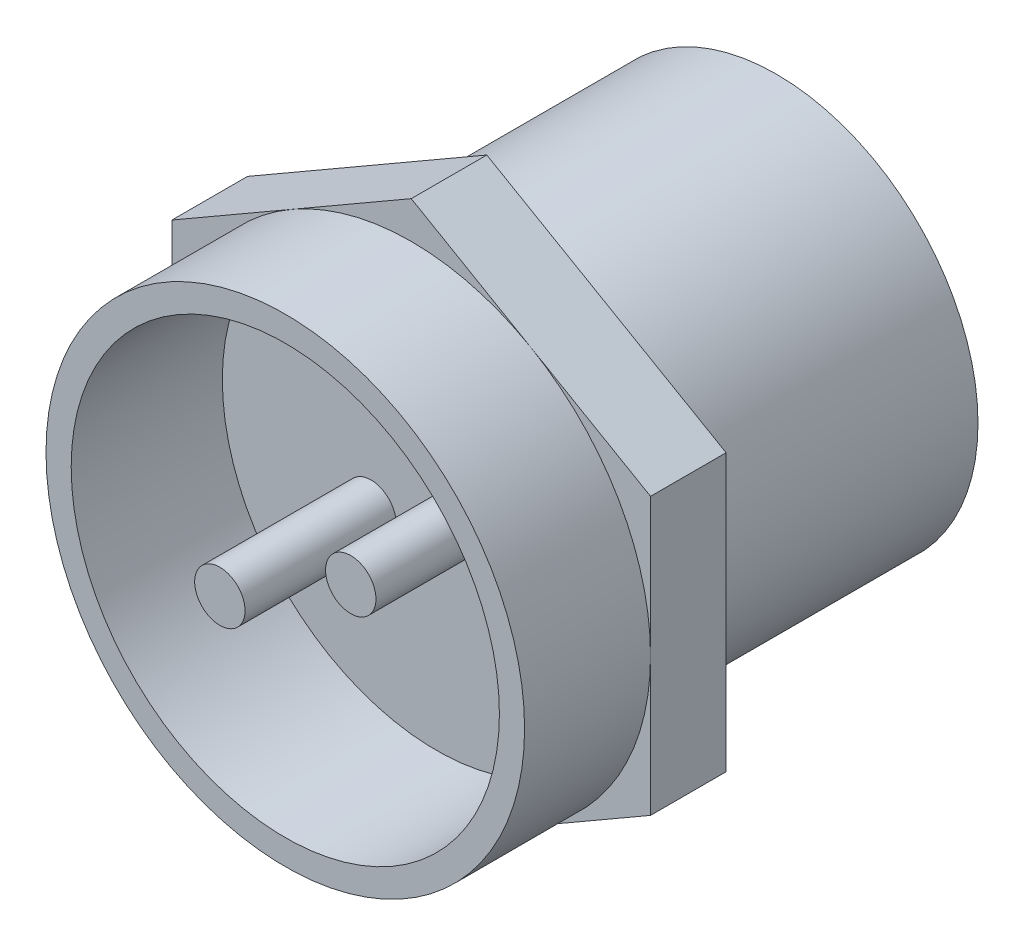
ISO-10303-21;
HEADER;
FILE_DESCRIPTION(('STEP AP214'),'2;1');
FILE_NAME('part.step','',(''),(''),'','','');
FILE_SCHEMA(('AUTOMOTIVE_DESIGN { 1 0 10303 214 1 1 1 1 }'));
ENDSEC;
DATA;
#1=APPLICATION_CONTEXT('core data for automotive mechanical design processes');
#2=APPLICATION_PROTOCOL_DEFINITION('international standard','automotive_design',2000,#1);
#3=PRODUCT_CONTEXT('',#1,'mechanical');
#4=PRODUCT('Part','Part','',(#3));
#5=PRODUCT_RELATED_PRODUCT_CATEGORY('part','',(#4));
#6=PRODUCT_DEFINITION_FORMATION('','',#4);
#7=PRODUCT_DEFINITION_CONTEXT('part definition',#1,'design');
#8=PRODUCT_DEFINITION('design','',#6,#7);
#9=PRODUCT_DEFINITION_SHAPE('','',#8);
#10=(LENGTH_UNIT() NAMED_UNIT(*) SI_UNIT(.MILLI.,.METRE.));
#11=(NAMED_UNIT(*) PLANE_ANGLE_UNIT() SI_UNIT($,.RADIAN.));
#12=(NAMED_UNIT(*) SI_UNIT($,.STERADIAN.) SOLID_ANGLE_UNIT());
#13=UNCERTAINTY_MEASURE_WITH_UNIT(LENGTH_MEASURE(1.E-05),#10,'distance_accuracy_value','');
#14=(GEOMETRIC_REPRESENTATION_CONTEXT(3) GLOBAL_UNCERTAINTY_ASSIGNED_CONTEXT((#13)) GLOBAL_UNIT_ASSIGNED_CONTEXT((#10,
#11,#12)) REPRESENTATION_CONTEXT('',''));
#15=CARTESIAN_POINT('',(0.,0.,0.));
#16=DIRECTION('',(0.,0.,1.));
#17=DIRECTION('',(1.,0.,0.));
#18=AXIS2_PLACEMENT_3D('',#15,#16,#17);
#19=CARTESIAN_POINT('',(0.,0.,8.));
#20=DIRECTION('',(0.,0.,1.));
#21=DIRECTION('',(1.,0.,0.));
#22=AXIS2_PLACEMENT_3D('',#19,#20,#21);
#23=PLANE('',#22);
#24=CARTESIAN_POINT('',(0.,0.,8.));
#25=DIRECTION('',(0.,0.,1.));
#26=DIRECTION('',(1.,0.,0.));
#27=AXIS2_PLACEMENT_3D('',#24,#25,#26);
#28=CIRCLE('',#27,8.5);
#29=CARTESIAN_POINT('',(8.5,0.,8.));
#30=VERTEX_POINT('',#29);
#31=EDGE_CURVE('E227',#30,#30,#28,.T.);
#32=ORIENTED_EDGE('',*,*,#31,.F.);
#33=EDGE_LOOP('',(#32));
#34=FACE_BOUND('',#33,.T.);
#35=CARTESIAN_POINT('',(0.,0.,8.));
#36=DIRECTION('',(0.,0.,1.));
#37=DIRECTION('',(1.,0.,0.));
#38=AXIS2_PLACEMENT_3D('',#35,#36,#37);
#39=CIRCLE('',#38,9.5);
#40=CARTESIAN_POINT('',(9.5,0.,8.));
#41=VERTEX_POINT('',#40);
#42=EDGE_CURVE('E148',#41,#41,#39,.T.);
#43=ORIENTED_EDGE('',*,*,#42,.T.);
#44=EDGE_LOOP('',(#43));
#45=FACE_BOUND('',#44,.T.);
#46=ADVANCED_FACE('F34',(#34,#45),#23,.T.);
#47=CARTESIAN_POINT('',(0.,0.,0.));
#48=DIRECTION('',(0.,0.,1.));
#49=DIRECTION('',(1.,0.,0.));
#50=AXIS2_PLACEMENT_3D('',#47,#48,#49);
#51=PLANE('',#50);
#52=DIRECTION('',(-0.866025403784439,0.5,0.));
#53=VECTOR('',#52,1.);
#54=CARTESIAN_POINT('',(0.,-10.9696551146029,0.));
#55=LINE('',#54,#53);
#56=CARTESIAN_POINT('',(0.,-10.9696551146029,0.));
#57=VERTEX_POINT('',#56);
#58=CARTESIAN_POINT('',(-9.5,-5.48482755730145,0.));
#59=VERTEX_POINT('',#58);
#60=EDGE_CURVE('E154',#57,#59,#55,.T.);
#61=ORIENTED_EDGE('',*,*,#60,.T.);
#62=DIRECTION('',(0.,1.,0.));
#63=VECTOR('',#62,1.);
#64=CARTESIAN_POINT('',(-9.5,-5.48482755730145,0.));
#65=LINE('',#64,#63);
#66=CARTESIAN_POINT('',(-9.5,5.48482755730145,0.));
#67=VERTEX_POINT('',#66);
#68=EDGE_CURVE('E114',#59,#67,#65,.T.);
#69=ORIENTED_EDGE('',*,*,#68,.T.);
#70=DIRECTION('',(0.866025403784439,0.5,0.));
#71=VECTOR('',#70,1.);
#72=CARTESIAN_POINT('',(-9.5,5.48482755730145,0.));
#73=LINE('',#72,#71);
#74=CARTESIAN_POINT('',(0.,10.9696551146029,0.));
#75=VERTEX_POINT('',#74);
#76=EDGE_CURVE('E146',#67,#75,#73,.T.);
#77=ORIENTED_EDGE('',*,*,#76,.T.);
#78=DIRECTION('',(0.866025403784439,-0.5,0.));
#79=VECTOR('',#78,1.);
#80=CARTESIAN_POINT('',(0.,10.9696551146029,0.));
#81=LINE('',#80,#79);
#82=CARTESIAN_POINT('',(9.5,5.48482755730145,0.));
#83=VERTEX_POINT('',#82);
#84=EDGE_CURVE('E121',#75,#83,#81,.T.);
#85=ORIENTED_EDGE('',*,*,#84,.T.);
#86=DIRECTION('',(0.,-1.,0.));
#87=VECTOR('',#86,1.);
#88=CARTESIAN_POINT('',(9.5,5.48482755730145,0.));
#89=LINE('',#88,#87);
#90=CARTESIAN_POINT('',(9.5,-5.48482755730145,0.));
#91=VERTEX_POINT('',#90);
#92=EDGE_CURVE('E150',#83,#91,#89,.T.);
#93=ORIENTED_EDGE('',*,*,#92,.T.);
#94=DIRECTION('',(-0.866025403784439,-0.5,0.));
#95=VECTOR('',#94,1.);
#96=CARTESIAN_POINT('',(9.5,-5.48482755730145,0.));
#97=LINE('',#96,#95);
#98=EDGE_CURVE('E152',#91,#57,#97,.T.);
#99=ORIENTED_EDGE('',*,*,#98,.T.);
#100=EDGE_LOOP('',(#61,#69,#77,#85,#93,#99));
#101=FACE_BOUND('',#100,.T.);
#102=CARTESIAN_POINT('',(0.,0.,0.));
#103=DIRECTION('',(0.,0.,1.));
#104=DIRECTION('',(1.,0.,0.));
#105=AXIS2_PLACEMENT_3D('',#102,#103,#104);
#106=CIRCLE('',#105,8.);
#107=CARTESIAN_POINT('',(8.,0.,0.));
#108=VERTEX_POINT('',#107);
#109=EDGE_CURVE('E172',#108,#108,#106,.F.);
#110=ORIENTED_EDGE('',*,*,#109,.F.);
#111=EDGE_LOOP('',(#110));
#112=FACE_BOUND('',#111,.T.);
#113=ADVANCED_FACE('F202',(#101,#112),#51,.F.);
#114=CARTESIAN_POINT('',(0.,0.,-11.5));
#115=DIRECTION('',(0.,0.,1.));
#116=DIRECTION('',(1.,0.,0.));
#117=AXIS2_PLACEMENT_3D('',#114,#115,#116);
#118=CYLINDRICAL_SURFACE('',#117,8.);
#119=CARTESIAN_POINT('',(0.,0.,-11.5));
#120=DIRECTION('',(0.,0.,-1.));
#121=DIRECTION('',(-1.,0.,0.));
#122=AXIS2_PLACEMENT_3D('',#119,#120,#121);
#123=CIRCLE('',#122,8.);
#124=CARTESIAN_POINT('',(-8.,0.,-11.5));
#125=VERTEX_POINT('',#124);
#126=EDGE_CURVE('E160',#125,#125,#123,.T.);
#127=ORIENTED_EDGE('',*,*,#126,.F.);
#128=EDGE_LOOP('',(#127));
#129=FACE_BOUND('',#128,.T.);
#130=ORIENTED_EDGE('',*,*,#109,.T.);
#131=EDGE_LOOP('',(#130));
#132=FACE_BOUND('',#131,.T.);
#133=ADVANCED_FACE('F252',(#129,#132),#118,.T.);
#134=CARTESIAN_POINT('',(0.,0.,-11.5));
#135=DIRECTION('',(0.,0.,-1.));
#136=DIRECTION('',(-1.,0.,0.));
#137=AXIS2_PLACEMENT_3D('',#134,#135,#136);
#138=PLANE('',#137);
#139=ORIENTED_EDGE('',*,*,#126,.T.);
#140=EDGE_LOOP('',(#139));
#141=FACE_BOUND('',#140,.T.);
#142=ADVANCED_FACE('F412',(#141),#138,.T.);
#143=CARTESIAN_POINT('',(-9.5,5.48482755730145,3.));
#144=DIRECTION('',(-0.5,0.866025403784439,0.));
#145=DIRECTION('',(-0.866025403784439,-0.5,0.));
#146=AXIS2_PLACEMENT_3D('',#143,#144,#145);
#147=PLANE('',#146);
#148=DIRECTION('',(0.,0.,-1.));
#149=VECTOR('',#148,1.);
#150=CARTESIAN_POINT('',(0.,10.9696551146029,3.));
#151=LINE('',#150,#149);
#152=CARTESIAN_POINT('',(0.,10.9696551146029,3.));
#153=VERTEX_POINT('',#152);
#154=EDGE_CURVE('E107',#153,#75,#151,.T.);
#155=ORIENTED_EDGE('',*,*,#154,.T.);
#156=ORIENTED_EDGE('',*,*,#76,.F.);
#157=DIRECTION('',(0.,0.,-1.));
#158=VECTOR('',#157,1.);
#159=CARTESIAN_POINT('',(-9.5,5.48482755730145,3.));
#160=LINE('',#159,#158);
#161=CARTESIAN_POINT('',(-9.5,5.48482755730145,3.));
#162=VERTEX_POINT('',#161);
#163=EDGE_CURVE('E157',#162,#67,#160,.T.);
#164=ORIENTED_EDGE('',*,*,#163,.F.);
#165=DIRECTION('',(0.866025403784439,0.5,0.));
#166=VECTOR('',#165,1.);
#167=CARTESIAN_POINT('',(-9.5,5.48482755730145,3.));
#168=LINE('',#167,#166);
#169=CARTESIAN_POINT('',(-4.75,8.22724133595217,3.));
#170=VERTEX_POINT('',#169);
#171=EDGE_CURVE('E111',#162,#170,#168,.T.);
#172=ORIENTED_EDGE('',*,*,#171,.T.);
#173=EDGE_CURVE('E103',#170,#153,#168,.T.);
#174=ORIENTED_EDGE('',*,*,#173,.T.);
#175=EDGE_LOOP('',(#155,#156,#164,#172,#174));
#176=FACE_BOUND('',#175,.T.);
#177=ADVANCED_FACE('F105',(#176),#147,.T.);
#178=CARTESIAN_POINT('',(-9.5,-5.48482755730145,3.));
#179=DIRECTION('',(-1.,0.,0.));
#180=DIRECTION('',(0.,-1.,0.));
#181=AXIS2_PLACEMENT_3D('',#178,#179,#180);
#182=PLANE('',#181);
#183=ORIENTED_EDGE('',*,*,#68,.F.);
#184=DIRECTION('',(0.,0.,-1.));
#185=VECTOR('',#184,1.);
#186=CARTESIAN_POINT('',(-9.5,-5.48482755730145,3.));
#187=LINE('',#186,#185);
#188=CARTESIAN_POINT('',(-9.5,-5.48482755730145,3.));
#189=VERTEX_POINT('',#188);
#190=EDGE_CURVE('E161',#189,#59,#187,.T.);
#191=ORIENTED_EDGE('',*,*,#190,.F.);
#192=DIRECTION('',(0.,1.,0.));
#193=VECTOR('',#192,1.);
#194=CARTESIAN_POINT('',(-9.5,-5.48482755730145,3.));
#195=LINE('',#194,#193);
#196=CARTESIAN_POINT('',(-9.5,0.,3.));
#197=VERTEX_POINT('',#196);
#198=EDGE_CURVE('E123',#189,#197,#195,.T.);
#199=ORIENTED_EDGE('',*,*,#198,.T.);
#200=EDGE_CURVE('E143',#197,#162,#195,.T.);
#201=ORIENTED_EDGE('',*,*,#200,.T.);
#202=ORIENTED_EDGE('',*,*,#163,.T.);
#203=EDGE_LOOP('',(#183,#191,#199,#201,#202));
#204=FACE_BOUND('',#203,.T.);
#205=ADVANCED_FACE('F394',(#204),#182,.T.);
#206=CARTESIAN_POINT('',(0.,-10.9696551146029,3.));
#207=DIRECTION('',(-0.5,-0.866025403784439,0.));
#208=DIRECTION('',(0.866025403784439,-0.5,0.));
#209=AXIS2_PLACEMENT_3D('',#206,#207,#208);
#210=PLANE('',#209);
#211=ORIENTED_EDGE('',*,*,#190,.T.);
#212=ORIENTED_EDGE('',*,*,#60,.F.);
#213=DIRECTION('',(0.,0.,-1.));
#214=VECTOR('',#213,1.);
#215=CARTESIAN_POINT('',(0.,-10.9696551146029,3.));
#216=LINE('',#215,#214);
#217=CARTESIAN_POINT('',(0.,-10.9696551146029,3.));
#218=VERTEX_POINT('',#217);
#219=EDGE_CURVE('E164',#218,#57,#216,.T.);
#220=ORIENTED_EDGE('',*,*,#219,.F.);
#221=DIRECTION('',(-0.866025403784439,0.5,0.));
#222=VECTOR('',#221,1.);
#223=CARTESIAN_POINT('',(0.,-10.9696551146029,3.));
#224=LINE('',#223,#222);
#225=CARTESIAN_POINT('',(-4.75,-8.22724133595217,3.));
#226=VERTEX_POINT('',#225);
#227=EDGE_CURVE('E140',#218,#226,#224,.T.);
#228=ORIENTED_EDGE('',*,*,#227,.T.);
#229=EDGE_CURVE('E139',#226,#189,#224,.T.);
#230=ORIENTED_EDGE('',*,*,#229,.T.);
#231=EDGE_LOOP('',(#211,#212,#220,#228,#230));
#232=FACE_BOUND('',#231,.T.);
#233=ADVANCED_FACE('F384',(#232),#210,.T.);
#234=CARTESIAN_POINT('',(9.5,-5.48482755730145,3.));
#235=DIRECTION('',(0.5,-0.866025403784438,0.));
#236=DIRECTION('',(0.866025403784439,0.5,0.));
#237=AXIS2_PLACEMENT_3D('',#234,#235,#236);
#238=PLANE('',#237);
#239=ORIENTED_EDGE('',*,*,#219,.T.);
#240=ORIENTED_EDGE('',*,*,#98,.F.);
#241=DIRECTION('',(0.,0.,-1.));
#242=VECTOR('',#241,1.);
#243=CARTESIAN_POINT('',(9.5,-5.48482755730145,3.));
#244=LINE('',#243,#242);
#245=CARTESIAN_POINT('',(9.5,-5.48482755730145,3.));
#246=VERTEX_POINT('',#245);
#247=EDGE_CURVE('E167',#246,#91,#244,.T.);
#248=ORIENTED_EDGE('',*,*,#247,.F.);
#249=DIRECTION('',(-0.866025403784439,-0.5,0.));
#250=VECTOR('',#249,1.);
#251=CARTESIAN_POINT('',(9.5,-5.48482755730145,3.));
#252=LINE('',#251,#250);
#253=CARTESIAN_POINT('',(4.75,-8.22724133595217,3.));
#254=VERTEX_POINT('',#253);
#255=EDGE_CURVE('E136',#246,#254,#252,.T.);
#256=ORIENTED_EDGE('',*,*,#255,.T.);
#257=EDGE_CURVE('E135',#254,#218,#252,.T.);
#258=ORIENTED_EDGE('',*,*,#257,.T.);
#259=EDGE_LOOP('',(#239,#240,#248,#256,#258));
#260=FACE_BOUND('',#259,.T.);
#261=ADVANCED_FACE('F375',(#260),#238,.T.);
#262=CARTESIAN_POINT('',(9.5,5.48482755730145,3.));
#263=DIRECTION('',(1.,0.,0.));
#264=DIRECTION('',(0.,0.,-1.));
#265=AXIS2_PLACEMENT_3D('',#262,#263,#264);
#266=PLANE('',#265);
#267=ORIENTED_EDGE('',*,*,#247,.T.);
#268=ORIENTED_EDGE('',*,*,#92,.F.);
#269=DIRECTION('',(0.,0.,-1.));
#270=VECTOR('',#269,1.);
#271=CARTESIAN_POINT('',(9.5,5.48482755730145,3.));
#272=LINE('',#271,#270);
#273=CARTESIAN_POINT('',(9.5,5.48482755730145,3.));
#274=VERTEX_POINT('',#273);
#275=EDGE_CURVE('E122',#274,#83,#272,.T.);
#276=ORIENTED_EDGE('',*,*,#275,.F.);
#277=DIRECTION('',(0.,-1.,0.));
#278=VECTOR('',#277,1.);
#279=CARTESIAN_POINT('',(9.5,5.48482755730145,3.));
#280=LINE('',#279,#278);
#281=CARTESIAN_POINT('',(9.5,0.,3.));
#282=VERTEX_POINT('',#281);
#283=EDGE_CURVE('E130',#274,#282,#280,.T.);
#284=ORIENTED_EDGE('',*,*,#283,.T.);
#285=EDGE_CURVE('E127',#282,#246,#280,.T.);
#286=ORIENTED_EDGE('',*,*,#285,.T.);
#287=EDGE_LOOP('',(#267,#268,#276,#284,#286));
#288=FACE_BOUND('',#287,.T.);
#289=ADVANCED_FACE('F198',(#288),#266,.T.);
#290=CARTESIAN_POINT('',(0.,10.9696551146029,3.));
#291=DIRECTION('',(0.5,0.866025403784439,0.));
#292=DIRECTION('',(-0.866025403784439,0.5,0.));
#293=AXIS2_PLACEMENT_3D('',#290,#291,#292);
#294=PLANE('',#293);
#295=ORIENTED_EDGE('',*,*,#275,.T.);
#296=ORIENTED_EDGE('',*,*,#84,.F.);
#297=ORIENTED_EDGE('',*,*,#154,.F.);
#298=DIRECTION('',(0.866025403784439,-0.5,0.));
#299=VECTOR('',#298,1.);
#300=CARTESIAN_POINT('',(0.,10.9696551146029,3.));
#301=LINE('',#300,#299);
#302=CARTESIAN_POINT('',(4.75,8.22724133595217,3.));
#303=VERTEX_POINT('',#302);
#304=EDGE_CURVE('E120',#153,#303,#301,.T.);
#305=ORIENTED_EDGE('',*,*,#304,.T.);
#306=EDGE_CURVE('E128',#303,#274,#301,.T.);
#307=ORIENTED_EDGE('',*,*,#306,.T.);
#308=EDGE_LOOP('',(#295,#296,#297,#305,#307));
#309=FACE_BOUND('',#308,.T.);
#310=ADVANCED_FACE('F119',(#309),#294,.T.);
#311=CARTESIAN_POINT('',(0.,0.,3.));
#312=DIRECTION('',(0.,0.,-1.));
#313=DIRECTION('',(-1.,0.,0.));
#314=AXIS2_PLACEMENT_3D('',#311,#312,#313);
#315=PLANE('',#314);
#316=ORIENTED_EDGE('',*,*,#200,.F.);
#317=CARTESIAN_POINT('',(0.,0.,3.));
#318=DIRECTION('',(0.,0.,-1.));
#319=DIRECTION('',(-1.,0.,0.));
#320=AXIS2_PLACEMENT_3D('',#317,#318,#319);
#321=CIRCLE('',#320,9.5);
#322=EDGE_CURVE('E11',#197,#170,#321,.T.);
#323=ORIENTED_EDGE('',*,*,#322,.T.);
#324=ORIENTED_EDGE('',*,*,#171,.F.);
#325=EDGE_LOOP('',(#316,#323,#324));
#326=FACE_BOUND('',#325,.T.);
#327=ADVANCED_FACE('F207',(#326),#315,.F.);
#328=ORIENTED_EDGE('',*,*,#173,.F.);
#329=EDGE_CURVE('E43',#170,#303,#321,.T.);
#330=ORIENTED_EDGE('',*,*,#329,.T.);
#331=ORIENTED_EDGE('',*,*,#304,.F.);
#332=EDGE_LOOP('',(#328,#330,#331));
#333=FACE_BOUND('',#332,.T.);
#334=ADVANCED_FACE('F125',(#333),#315,.F.);
#335=ORIENTED_EDGE('',*,*,#306,.F.);
#336=EDGE_CURVE('E53',#303,#282,#321,.T.);
#337=ORIENTED_EDGE('',*,*,#336,.T.);
#338=ORIENTED_EDGE('',*,*,#283,.F.);
#339=EDGE_LOOP('',(#335,#337,#338));
#340=FACE_BOUND('',#339,.T.);
#341=ADVANCED_FACE('F193',(#340),#315,.F.);
#342=ORIENTED_EDGE('',*,*,#285,.F.);
#343=EDGE_CURVE('E183',#282,#254,#321,.T.);
#344=ORIENTED_EDGE('',*,*,#343,.T.);
#345=ORIENTED_EDGE('',*,*,#255,.F.);
#346=EDGE_LOOP('',(#342,#344,#345));
#347=FACE_BOUND('',#346,.T.);
#348=ADVANCED_FACE('F194',(#347),#315,.F.);
#349=ORIENTED_EDGE('',*,*,#257,.F.);
#350=EDGE_CURVE('E177',#254,#226,#321,.T.);
#351=ORIENTED_EDGE('',*,*,#350,.T.);
#352=ORIENTED_EDGE('',*,*,#227,.F.);
#353=EDGE_LOOP('',(#349,#351,#352));
#354=FACE_BOUND('',#353,.T.);
#355=ADVANCED_FACE('F324',(#354),#315,.F.);
#356=ORIENTED_EDGE('',*,*,#229,.F.);
#357=EDGE_CURVE('E38',#226,#197,#321,.T.);
#358=ORIENTED_EDGE('',*,*,#357,.T.);
#359=ORIENTED_EDGE('',*,*,#198,.F.);
#360=EDGE_LOOP('',(#356,#358,#359));
#361=FACE_BOUND('',#360,.T.);
#362=ADVANCED_FACE('F211',(#361),#315,.F.);
#363=CARTESIAN_POINT('',(0.,0.,5.));
#364=DIRECTION('',(0.,0.,-1.));
#365=DIRECTION('',(-1.,0.,0.));
#366=AXIS2_PLACEMENT_3D('',#363,#364,#365);
#367=CYLINDRICAL_SURFACE('',#366,9.5);
#368=ORIENTED_EDGE('',*,*,#322,.F.);
#369=ORIENTED_EDGE('',*,*,#357,.F.);
#370=ORIENTED_EDGE('',*,*,#350,.F.);
#371=ORIENTED_EDGE('',*,*,#343,.F.);
#372=ORIENTED_EDGE('',*,*,#336,.F.);
#373=ORIENTED_EDGE('',*,*,#329,.F.);
#374=EDGE_LOOP('',(#368,#369,#370,#371,#372,#373));
#375=FACE_BOUND('',#374,.T.);
#376=ORIENTED_EDGE('',*,*,#42,.F.);
#377=EDGE_LOOP('',(#376));
#378=FACE_BOUND('',#377,.T.);
#379=ADVANCED_FACE('F36',(#375,#378),#367,.T.);
#380=CARTESIAN_POINT('',(2.59807621135332,1.5,2.));
#381=DIRECTION('',(0.,0.,1.));
#382=DIRECTION('',(1.,0.,0.));
#383=AXIS2_PLACEMENT_3D('',#380,#381,#382);
#384=CYLINDRICAL_SURFACE('',#383,1.);
#385=CARTESIAN_POINT('',(2.59807621135332,1.5,2.));
#386=DIRECTION('',(0.,0.,1.));
#387=DIRECTION('',(1.,0.,0.));
#388=AXIS2_PLACEMENT_3D('',#385,#386,#387);
#389=CIRCLE('',#388,1.);
#390=CARTESIAN_POINT('',(3.59807621135332,1.5,2.));
#391=VERTEX_POINT('',#390);
#392=EDGE_CURVE('E217',#391,#391,#389,.T.);
#393=ORIENTED_EDGE('',*,*,#392,.T.);
#394=EDGE_LOOP('',(#393));
#395=FACE_BOUND('',#394,.T.);
#396=CARTESIAN_POINT('',(2.59807621135332,1.5,8.));
#397=DIRECTION('',(0.,0.,1.));
#398=DIRECTION('',(1.,0.,0.));
#399=AXIS2_PLACEMENT_3D('',#396,#397,#398);
#400=CIRCLE('',#399,1.);
#401=CARTESIAN_POINT('',(3.59807621135332,1.5,8.));
#402=VERTEX_POINT('',#401);
#403=EDGE_CURVE('E224',#402,#402,#400,.T.);
#404=ORIENTED_EDGE('',*,*,#403,.F.);
#405=EDGE_LOOP('',(#404));
#406=FACE_BOUND('',#405,.T.);
#407=ADVANCED_FACE('F210',(#395,#406),#384,.T.);
#408=CARTESIAN_POINT('',(0.,0.,2.));
#409=DIRECTION('',(0.,0.,1.));
#410=DIRECTION('',(1.,0.,0.));
#411=AXIS2_PLACEMENT_3D('',#408,#409,#410);
#412=CYLINDRICAL_SURFACE('',#411,8.5);
#413=CARTESIAN_POINT('',(0.,0.,2.));
#414=DIRECTION('',(0.,0.,1.));
#415=DIRECTION('',(1.,0.,0.));
#416=AXIS2_PLACEMENT_3D('',#413,#414,#415);
#417=CIRCLE('',#416,8.5);
#418=CARTESIAN_POINT('',(8.5,0.,2.));
#419=VERTEX_POINT('',#418);
#420=EDGE_CURVE('E223',#419,#419,#417,.T.);
#421=ORIENTED_EDGE('',*,*,#420,.F.);
#422=EDGE_LOOP('',(#421));
#423=FACE_BOUND('',#422,.T.);
#424=ORIENTED_EDGE('',*,*,#31,.T.);
#425=EDGE_LOOP('',(#424));
#426=FACE_BOUND('',#425,.T.);
#427=ADVANCED_FACE('F238',(#423,#426),#412,.F.);
#428=CARTESIAN_POINT('',(-2.59807621135332,-1.5,2.));
#429=DIRECTION('',(0.,0.,1.));
#430=DIRECTION('',(1.,0.,0.));
#431=AXIS2_PLACEMENT_3D('',#428,#429,#430);
#432=CYLINDRICAL_SURFACE('',#431,1.);
#433=CARTESIAN_POINT('',(-2.59807621135332,-1.5,2.));
#434=DIRECTION('',(0.,0.,1.));
#435=DIRECTION('',(1.,0.,0.));
#436=AXIS2_PLACEMENT_3D('',#433,#434,#435);
#437=CIRCLE('',#436,1.);
#438=CARTESIAN_POINT('',(-1.59807621135331,-1.5,2.));
#439=VERTEX_POINT('',#438);
#440=EDGE_CURVE('E215',#439,#439,#437,.F.);
#441=ORIENTED_EDGE('',*,*,#440,.F.);
#442=EDGE_LOOP('',(#441));
#443=FACE_BOUND('',#442,.T.);
#444=CARTESIAN_POINT('',(-2.59807621135332,-1.5,8.));
#445=DIRECTION('',(0.,0.,1.));
#446=DIRECTION('',(1.,0.,0.));
#447=AXIS2_PLACEMENT_3D('',#444,#445,#446);
#448=CIRCLE('',#447,1.);
#449=CARTESIAN_POINT('',(-1.59807621135331,-1.5,8.));
#450=VERTEX_POINT('',#449);
#451=EDGE_CURVE('E220',#450,#450,#448,.F.);
#452=ORIENTED_EDGE('',*,*,#451,.T.);
#453=EDGE_LOOP('',(#452));
#454=FACE_BOUND('',#453,.T.);
#455=ADVANCED_FACE('F241',(#443,#454),#432,.T.);
#456=CARTESIAN_POINT('',(0.,0.,2.));
#457=DIRECTION('',(0.,0.,1.));
#458=DIRECTION('',(1.,0.,0.));
#459=AXIS2_PLACEMENT_3D('',#456,#457,#458);
#460=PLANE('',#459);
#461=ORIENTED_EDGE('',*,*,#420,.T.);
#462=EDGE_LOOP('',(#461));
#463=FACE_BOUND('',#462,.T.);
#464=ORIENTED_EDGE('',*,*,#392,.F.);
#465=EDGE_LOOP('',(#464));
#466=FACE_BOUND('',#465,.T.);
#467=ORIENTED_EDGE('',*,*,#440,.T.);
#468=EDGE_LOOP('',(#467));
#469=FACE_BOUND('',#468,.T.);
#470=ADVANCED_FACE('F235',(#463,#466,#469),#460,.T.);
#471=ORIENTED_EDGE('',*,*,#403,.T.);
#472=EDGE_LOOP('',(#471));
#473=FACE_BOUND('',#472,.T.);
#474=ADVANCED_FACE('F248',(#473),#23,.T.);
#475=ORIENTED_EDGE('',*,*,#451,.F.);
#476=EDGE_LOOP('',(#475));
#477=FACE_BOUND('',#476,.T.);
#478=ADVANCED_FACE('F247',(#477),#23,.T.);
#479=CLOSED_SHELL('',(#46,#113,#133,#142,#177,#205,#233,#261,#289,#310,#327,#334,#341,#348,#355,
#362,#379,#407,#427,#455,#470,#474,#478));
#480=MANIFOLD_SOLID_BREP('B2',#479);
#481=ADVANCED_BREP_SHAPE_REPRESENTATION('',(#18,#480),#14);
#482=SHAPE_DEFINITION_REPRESENTATION(#9,#481);
ENDSEC;
END-ISO-10303-21;
